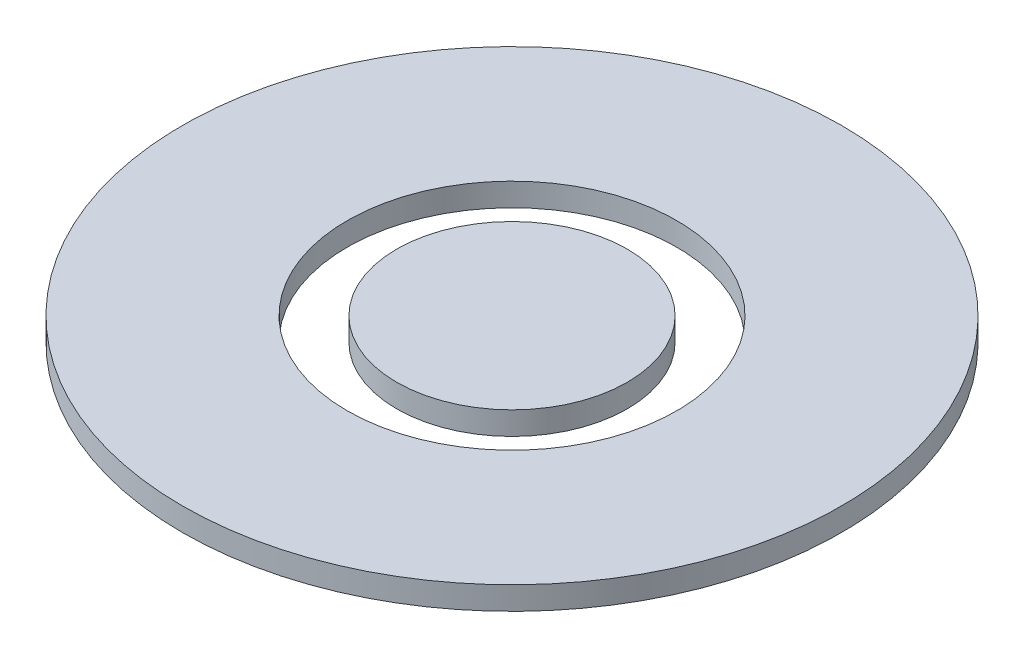
ISO-10303-21;
HEADER;
FILE_DESCRIPTION(('STEP AP214'),'2;1');
FILE_NAME('part.step','',(''),(''),'','','');
FILE_SCHEMA(('AUTOMOTIVE_DESIGN { 1 0 10303 214 1 1 1 1 }'));
ENDSEC;
DATA;
#1=APPLICATION_CONTEXT('core data for automotive mechanical design processes');
#2=APPLICATION_PROTOCOL_DEFINITION('international standard','automotive_design',2000,#1);
#3=PRODUCT_CONTEXT('',#1,'mechanical');
#4=PRODUCT('Part','Part','',(#3));
#5=PRODUCT_RELATED_PRODUCT_CATEGORY('part','',(#4));
#6=PRODUCT_DEFINITION_FORMATION('','',#4);
#7=PRODUCT_DEFINITION_CONTEXT('part definition',#1,'design');
#8=PRODUCT_DEFINITION('design','',#6,#7);
#9=PRODUCT_DEFINITION_SHAPE('','',#8);
#10=(LENGTH_UNIT() NAMED_UNIT(*) SI_UNIT(.MILLI.,.METRE.));
#11=(NAMED_UNIT(*) PLANE_ANGLE_UNIT() SI_UNIT($,.RADIAN.));
#12=(NAMED_UNIT(*) SI_UNIT($,.STERADIAN.) SOLID_ANGLE_UNIT());
#13=UNCERTAINTY_MEASURE_WITH_UNIT(LENGTH_MEASURE(1.E-05),#10,'distance_accuracy_value','');
#14=(GEOMETRIC_REPRESENTATION_CONTEXT(3) GLOBAL_UNCERTAINTY_ASSIGNED_CONTEXT((#13)) GLOBAL_UNIT_ASSIGNED_CONTEXT((#10,
#11,#12)) REPRESENTATION_CONTEXT('',''));
#15=CARTESIAN_POINT('',(0.,0.,0.));
#16=DIRECTION('',(0.,0.,1.));
#17=DIRECTION('',(1.,0.,0.));
#18=AXIS2_PLACEMENT_3D('',#15,#16,#17);
#19=CARTESIAN_POINT('',(0.,0.7,0.));
#20=DIRECTION('',(0.,-1.,0.));
#21=DIRECTION('',(0.,0.,-1.));
#22=AXIS2_PLACEMENT_3D('',#19,#20,#21);
#23=CYLINDRICAL_SURFACE('',#22,3.5);
#24=CARTESIAN_POINT('',(0.,0.7,0.));
#25=DIRECTION('',(0.,1.,0.));
#26=DIRECTION('',(0.,0.,1.));
#27=AXIS2_PLACEMENT_3D('',#24,#25,#26);
#28=CIRCLE('',#27,3.5);
#29=CARTESIAN_POINT('',(0.,0.7,3.5));
#30=VERTEX_POINT('',#29);
#31=EDGE_CURVE('E12',#30,#30,#28,.T.);
#32=ORIENTED_EDGE('',*,*,#31,.F.);
#33=EDGE_LOOP('',(#32));
#34=FACE_BOUND('',#33,.T.);
#35=CARTESIAN_POINT('',(0.,0.,0.));
#36=DIRECTION('',(0.,1.,0.));
#37=DIRECTION('',(0.,0.,1.));
#38=AXIS2_PLACEMENT_3D('',#35,#36,#37);
#39=CIRCLE('',#38,3.5);
#40=CARTESIAN_POINT('',(0.,0.,3.5));
#41=VERTEX_POINT('',#40);
#42=EDGE_CURVE('E48',#41,#41,#39,.T.);
#43=ORIENTED_EDGE('',*,*,#42,.T.);
#44=EDGE_LOOP('',(#43));
#45=FACE_BOUND('',#44,.T.);
#46=ADVANCED_FACE('F45',(#34,#45),#23,.T.);
#47=CARTESIAN_POINT('',(0.,0.7,0.));
#48=DIRECTION('',(0.,1.,0.));
#49=DIRECTION('',(0.,0.,1.));
#50=AXIS2_PLACEMENT_3D('',#47,#48,#49);
#51=PLANE('',#50);
#52=ORIENTED_EDGE('',*,*,#31,.T.);
#53=EDGE_LOOP('',(#52));
#54=FACE_BOUND('',#53,.T.);
#55=ADVANCED_FACE('F60',(#54),#51,.T.);
#56=CARTESIAN_POINT('',(0.,0.,0.));
#57=DIRECTION('',(0.,1.,0.));
#58=DIRECTION('',(0.,0.,1.));
#59=AXIS2_PLACEMENT_3D('',#56,#57,#58);
#60=PLANE('',#59);
#61=ORIENTED_EDGE('',*,*,#42,.F.);
#62=EDGE_LOOP('',(#61));
#63=FACE_BOUND('',#62,.T.);
#64=ADVANCED_FACE('F58',(#63),#60,.F.);
#65=CLOSED_SHELL('',(#46,#55,#64));
#66=MANIFOLD_SOLID_BREP('B2',#65);
#67=CARTESIAN_POINT('',(0.,0.7,0.));
#68=DIRECTION('',(0.,1.,0.));
#69=DIRECTION('',(0.,0.,1.));
#70=AXIS2_PLACEMENT_3D('',#67,#68,#69);
#71=PLANE('',#70);
#72=CARTESIAN_POINT('',(0.,0.7,0.));
#73=DIRECTION('',(0.,1.,0.));
#74=DIRECTION('',(0.,0.,1.));
#75=AXIS2_PLACEMENT_3D('',#72,#73,#74);
#76=CIRCLE('',#75,10.);
#77=CARTESIAN_POINT('',(0.,0.7,10.));
#78=VERTEX_POINT('',#77);
#79=EDGE_CURVE('E44',#78,#78,#76,.T.);
#80=ORIENTED_EDGE('',*,*,#79,.T.);
#81=EDGE_LOOP('',(#80));
#82=FACE_BOUND('',#81,.T.);
#83=CARTESIAN_POINT('',(0.,0.7,0.));
#84=DIRECTION('',(0.,1.,0.));
#85=DIRECTION('',(0.,0.,1.));
#86=AXIS2_PLACEMENT_3D('',#83,#84,#85);
#87=CIRCLE('',#86,5.);
#88=CARTESIAN_POINT('',(0.,0.7,5.));
#89=VERTEX_POINT('',#88);
#90=EDGE_CURVE('E97',#89,#89,#87,.T.);
#91=ORIENTED_EDGE('',*,*,#90,.F.);
#92=EDGE_LOOP('',(#91));
#93=FACE_BOUND('',#92,.T.);
#94=ADVANCED_FACE('F86',(#82,#93),#71,.T.);
#95=CARTESIAN_POINT('',(0.,0.,0.));
#96=DIRECTION('',(0.,1.,0.));
#97=DIRECTION('',(0.,0.,1.));
#98=AXIS2_PLACEMENT_3D('',#95,#96,#97);
#99=PLANE('',#98);
#100=CARTESIAN_POINT('',(0.,0.,0.));
#101=DIRECTION('',(0.,1.,0.));
#102=DIRECTION('',(0.,0.,1.));
#103=AXIS2_PLACEMENT_3D('',#100,#101,#102);
#104=CIRCLE('',#103,10.);
#105=CARTESIAN_POINT('',(0.,0.,10.));
#106=VERTEX_POINT('',#105);
#107=EDGE_CURVE('E90',#106,#106,#104,.T.);
#108=ORIENTED_EDGE('',*,*,#107,.F.);
#109=EDGE_LOOP('',(#108));
#110=FACE_BOUND('',#109,.T.);
#111=CARTESIAN_POINT('',(0.,0.,0.));
#112=DIRECTION('',(0.,1.,0.));
#113=DIRECTION('',(0.,0.,1.));
#114=AXIS2_PLACEMENT_3D('',#111,#112,#113);
#115=CIRCLE('',#114,5.);
#116=CARTESIAN_POINT('',(0.,0.,5.));
#117=VERTEX_POINT('',#116);
#118=EDGE_CURVE('E99',#117,#117,#115,.T.);
#119=ORIENTED_EDGE('',*,*,#118,.T.);
#120=EDGE_LOOP('',(#119));
#121=FACE_BOUND('',#120,.T.);
#122=ADVANCED_FACE('F109',(#110,#121),#99,.F.);
#123=CARTESIAN_POINT('',(0.,0.7,0.));
#124=DIRECTION('',(0.,-1.,0.));
#125=DIRECTION('',(0.,0.,-1.));
#126=AXIS2_PLACEMENT_3D('',#123,#124,#125);
#127=CYLINDRICAL_SURFACE('',#126,10.);
#128=ORIENTED_EDGE('',*,*,#79,.F.);
#129=EDGE_LOOP('',(#128));
#130=FACE_BOUND('',#129,.T.);
#131=ORIENTED_EDGE('',*,*,#107,.T.);
#132=EDGE_LOOP('',(#131));
#133=FACE_BOUND('',#132,.T.);
#134=ADVANCED_FACE('F88',(#130,#133),#127,.T.);
#135=CARTESIAN_POINT('',(0.,0.7,0.));
#136=DIRECTION('',(0.,-1.,0.));
#137=DIRECTION('',(0.,0.,-1.));
#138=AXIS2_PLACEMENT_3D('',#135,#136,#137);
#139=CYLINDRICAL_SURFACE('',#138,5.);
#140=ORIENTED_EDGE('',*,*,#90,.T.);
#141=EDGE_LOOP('',(#140));
#142=FACE_BOUND('',#141,.T.);
#143=ORIENTED_EDGE('',*,*,#118,.F.);
#144=EDGE_LOOP('',(#143));
#145=FACE_BOUND('',#144,.T.);
#146=ADVANCED_FACE('F105',(#142,#145),#139,.F.);
#147=CLOSED_SHELL('',(#94,#122,#134,#146));
#148=MANIFOLD_SOLID_BREP('B7',#147);
#149=ADVANCED_BREP_SHAPE_REPRESENTATION('',(#18,#66,#148),#14);
#150=SHAPE_DEFINITION_REPRESENTATION(#9,#149);
ENDSEC;
END-ISO-10303-21;
